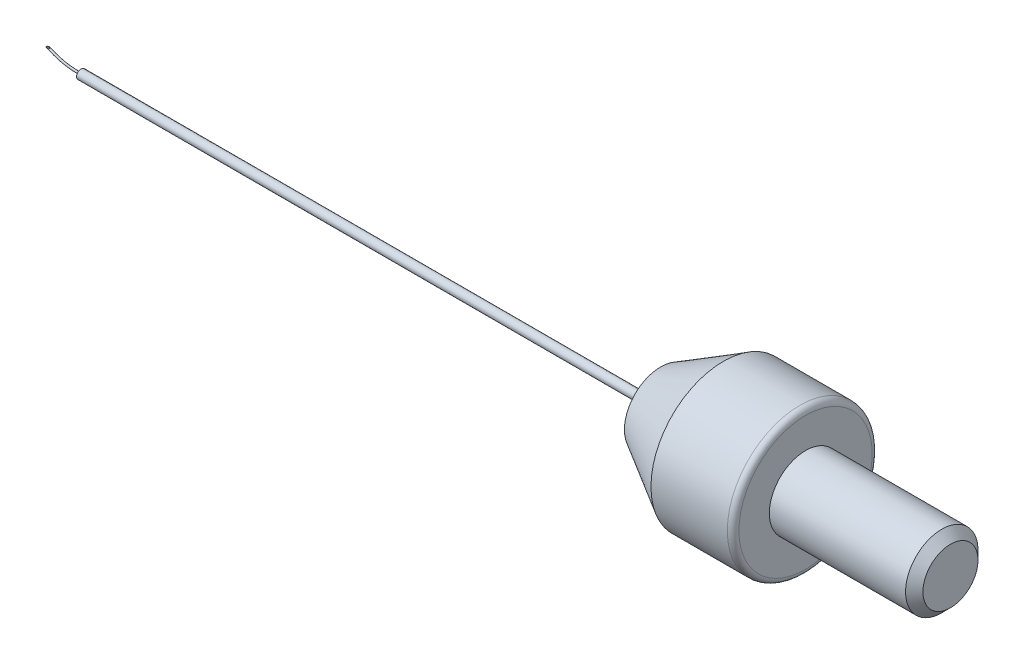
ISO-10303-21;
HEADER;
FILE_DESCRIPTION(('STEP AP214'),'2;1');
FILE_NAME('part.step','',(''),(''),'','','');
FILE_SCHEMA(('AUTOMOTIVE_DESIGN { 1 0 10303 214 1 1 1 1 }'));
ENDSEC;
DATA;
#1=APPLICATION_CONTEXT('core data for automotive mechanical design processes');
#2=APPLICATION_PROTOCOL_DEFINITION('international standard','automotive_design',2000,#1);
#3=PRODUCT_CONTEXT('',#1,'mechanical');
#4=PRODUCT('Part','Part','',(#3));
#5=PRODUCT_RELATED_PRODUCT_CATEGORY('part','',(#4));
#6=PRODUCT_DEFINITION_FORMATION('','',#4);
#7=PRODUCT_DEFINITION_CONTEXT('part definition',#1,'design');
#8=PRODUCT_DEFINITION('design','',#6,#7);
#9=PRODUCT_DEFINITION_SHAPE('','',#8);
#10=(LENGTH_UNIT() NAMED_UNIT(*) SI_UNIT(.MILLI.,.METRE.));
#11=(NAMED_UNIT(*) PLANE_ANGLE_UNIT() SI_UNIT($,.RADIAN.));
#12=(NAMED_UNIT(*) SI_UNIT($,.STERADIAN.) SOLID_ANGLE_UNIT());
#13=UNCERTAINTY_MEASURE_WITH_UNIT(LENGTH_MEASURE(1.E-05),#10,'distance_accuracy_value','');
#14=(GEOMETRIC_REPRESENTATION_CONTEXT(3) GLOBAL_UNCERTAINTY_ASSIGNED_CONTEXT((#13)) GLOBAL_UNIT_ASSIGNED_CONTEXT((#10,
#11,#12)) REPRESENTATION_CONTEXT('',''));
#15=CARTESIAN_POINT('',(0.,0.,0.));
#16=DIRECTION('',(0.,0.,1.));
#17=DIRECTION('',(1.,0.,0.));
#18=AXIS2_PLACEMENT_3D('',#15,#16,#17);
#19=CARTESIAN_POINT('',(-27.,0.,0.035));
#20=CARTESIAN_POINT('',(-27.4170242884597,-0.0146836206256108,0.035));
#21=CARTESIAN_POINT('',(-27.8116297868621,0.0708827797584399,0.035));
#22=CARTESIAN_POINT('',(-28.1838164951991,0.256699201155364,0.035));
#23=CARTESIAN_POINT('',(-27.,0.07,0.035));
#24=CARTESIAN_POINT('',(-27.4059080293465,0.0553163802134395,0.035));
#25=CARTESIAN_POINT('',(-27.7880030400854,0.137717553772996,0.035));
#26=CARTESIAN_POINT('',(-28.1503643792375,0.318188679423537,0.035));
#27=CARTESIAN_POINT('',(-27.,0.07,-0.035));
#28=CARTESIAN_POINT('',(-27.4059080293465,0.0553163802134404,-0.035));
#29=CARTESIAN_POINT('',(-27.7880030400854,0.137717553772996,-0.035));
#30=CARTESIAN_POINT('',(-28.1503643792375,0.318188679423537,-0.035));
#31=CARTESIAN_POINT('',(-27.,0.,-0.035));
#32=CARTESIAN_POINT('',(-27.4170242884597,-0.0146836206256099,-0.035));
#33=CARTESIAN_POINT('',(-27.8116297868621,0.0708827797584399,-0.035));
#34=CARTESIAN_POINT('',(-28.1838164951991,0.256699201155364,-0.035));
#35=CARTESIAN_POINT('',(-27.,-0.07,-0.035));
#36=CARTESIAN_POINT('',(-27.4281405475729,-0.0846836214646603,-0.035));
#37=CARTESIAN_POINT('',(-27.8352565336389,0.00404800574388422,-0.035));
#38=CARTESIAN_POINT('',(-28.2172686111607,0.195209722887191,-0.035));
#39=CARTESIAN_POINT('',(-27.,-0.07,0.035));
#40=CARTESIAN_POINT('',(-27.4281405475729,-0.0846836214646611,0.035));
#41=CARTESIAN_POINT('',(-27.8352565336389,0.00404800574388422,0.035));
#42=CARTESIAN_POINT('',(-28.2172686111607,0.195209722887191,0.035));
#43=CARTESIAN_POINT('',(-27.,0.,0.035));
#44=CARTESIAN_POINT('',(-27.4170242884597,-0.0146836206256108,0.035));
#45=CARTESIAN_POINT('',(-27.8116297868621,0.0708827797584399,0.035));
#46=CARTESIAN_POINT('',(-28.1838164951991,0.256699201155364,0.035));
#47=(BOUNDED_SURFACE() B_SPLINE_SURFACE(3,3,((#19,#20,#21,#22),(#23,#24,#25,#26),(#27,#28,#29,
#30),(#31,#32,#33,#34),(#35,#36,#37,#38),(#39,#40,#41,#42),(#43,#44,#45,#46)),.UNSPECIFIED.,.T.,
.F.,.F.) B_SPLINE_SURFACE_WITH_KNOTS((4,3,4),(4,4),(0.,0.5,1.),(0.,1.),
.UNSPECIFIED.) GEOMETRIC_REPRESENTATION_ITEM() RATIONAL_B_SPLINE_SURFACE(((1.,1.,1.,1.),
(0.333333333333333,0.333333333333333,0.333333333333333,0.333333333333333),(0.333333333333333,
0.333333333333333,0.333333333333333,0.333333333333333),(1.,1.,1.,1.),(0.333333333333333,
0.333333333333333,0.333333333333333,0.333333333333333),(0.333333333333333,0.333333333333333,
0.333333333333333,0.333333333333333),(1.,1.,1.,1.))) REPRESENTATION_ITEM('') SURFACE());
#48=CARTESIAN_POINT('',(-27.,0.,0.));
#49=DIRECTION('',(-1.,0.,0.));
#50=DIRECTION('',(0.,0.,1.));
#51=AXIS2_PLACEMENT_3D('',#48,#49,#50);
#52=CIRCLE('',#51,0.035);
#53=CARTESIAN_POINT('',(-27.,0.,0.035));
#54=VERTEX_POINT('',#53);
#55=EDGE_CURVE('E64',#54,#54,#52,.T.);
#56=CARTESIAN_POINT('',(-28.1345079441962,0.232730172733482,0.035));
#57=CARTESIAN_POINT('',(-28.1403781410976,0.23212784171849,0.035000459442131));
#58=CARTESIAN_POINT('',(-28.1462495657998,0.231525380258844,0.0346042798892061));
#59=CARTESIAN_POINT('',(-28.1578682816208,0.230333199516062,0.0329435476940316));
#60=CARTESIAN_POINT('',(-28.1636158331756,0.229743453498144,0.0316810482643481));
#61=CARTESIAN_POINT('',(-28.1737201674923,0.228706664503048,0.0284117801471621));
#62=CARTESIAN_POINT('',(-28.1781354643464,0.228253617736801,0.0265892530971109));
#63=CARTESIAN_POINT('',(-28.1865254616945,0.22739273333318,0.0219359519237533));
#64=CARTESIAN_POINT('',(-28.1904972343875,0.2269851961143,0.0190989442661192));
#65=CARTESIAN_POINT('',(-28.1955694949955,0.226464739609817,0.0136033069795441));
#66=CARTESIAN_POINT('',(-28.1971607842477,0.226301459981525,0.0114285434972753));
#67=CARTESIAN_POINT('',(-28.1995406461706,0.226057266140342,0.00660336952401806));
#68=CARTESIAN_POINT('',(-28.2003216709279,0.225977126406317,0.00394875237267297));
#69=CARTESIAN_POINT('',(-28.2006548799446,0.22594293634295,-0.00106177049862607));
#70=CARTESIAN_POINT('',(-28.2003660303625,0.225972574744379,-0.00340646622919166));
#71=CARTESIAN_POINT('',(-28.1990778570449,0.226104752157446,-0.00768835343020406));
#72=CARTESIAN_POINT('',(-28.1981295770486,0.22620205365306,-0.00964257008199435));
#73=CARTESIAN_POINT('',(-28.1950478028521,0.226518269584318,-0.0144362443135136));
#74=CARTESIAN_POINT('',(-28.1925446498112,0.226775114125637,-0.0170226809346205));
#75=CARTESIAN_POINT('',(-28.1851587654535,0.227532967937244,-0.0230465137879778));
#76=CARTESIAN_POINT('',(-28.1798185365821,0.228080920300025,-0.0258584137310062));
#77=CARTESIAN_POINT('',(-28.1692759894893,0.229162674235667,-0.0300288540523444));
#78=CARTESIAN_POINT('',(-28.1641119720879,0.229692545822327,-0.0315033401535746));
#79=CARTESIAN_POINT('',(-28.1536222276332,0.230768881764481,-0.033672377200365));
#80=CARTESIAN_POINT('',(-28.1482964559816,0.231315350696142,-0.0343667110027478));
#81=CARTESIAN_POINT('',(-28.1372382599205,0.232450014551239,-0.0351006803877984));
#82=CARTESIAN_POINT('',(-28.1315030290277,0.233038497443525,-0.0350920736940076));
#83=CARTESIAN_POINT('',(-28.1200120245339,0.234217571078399,-0.0343151592491671));
#84=CARTESIAN_POINT('',(-28.1142567673076,0.234808108836553,-0.033538156204836));
#85=CARTESIAN_POINT('',(-28.1029284227986,0.235970492201412,-0.0311310101604022));
#86=CARTESIAN_POINT('',(-28.0973554312331,0.236542327986732,-0.0295004263079689));
#87=CARTESIAN_POINT('',(-28.0862801539766,0.237678744480527,-0.0250013094387353));
#88=CARTESIAN_POINT('',(-28.0807978240134,0.238241277560365,-0.0220708610118972));
#89=CARTESIAN_POINT('',(-28.0738781793501,0.238951291261933,-0.0163224385899703));
#90=CARTESIAN_POINT('',(-28.0718388080235,0.239160547912472,-0.0142710858178655));
#91=CARTESIAN_POINT('',(-28.0684454261573,0.239508737442051,-0.00955690671724776));
#92=CARTESIAN_POINT('',(-28.067098896239,0.239646902746534,-0.00688783966494199));
#93=CARTESIAN_POINT('',(-28.065989555461,0.239760730441867,-0.002104956635132));
#94=CARTESIAN_POINT('',(-28.0658599651098,0.239774027498162,-8.34189472398771E-05));
#95=CARTESIAN_POINT('',(-28.0662874231324,0.239730166710831,0.0038759133525735));
#96=CARTESIAN_POINT('',(-28.0668437474732,0.239673083159079,0.00581379403718324));
#97=CARTESIAN_POINT('',(-28.0687913911255,0.23947323855139,0.01018969643692));
#98=CARTESIAN_POINT('',(-28.0704312933857,0.239304970794479,0.0125077263755494));
#99=CARTESIAN_POINT('',(-28.0753864642481,0.23879652862486,0.0179573232703016));
#100=CARTESIAN_POINT('',(-28.079106378606,0.238414834164995,0.0206816198412609));
#101=CARTESIAN_POINT('',(-28.0867442059386,0.237631128847394,0.0251126551619395));
#102=CARTESIAN_POINT('',(-28.0906361119515,0.237231786527075,0.026871419423226));
#103=CARTESIAN_POINT('',(-28.0986322430501,0.2364113164199,0.0298195834445177));
#104=CARTESIAN_POINT('',(-28.1027367340424,0.235990161349111,0.0310082500765262));
#105=CARTESIAN_POINT('',(-28.1113888352926,0.235102382473736,0.0329884001394123));
#106=CARTESIAN_POINT('',(-28.1159452303133,0.234634857197722,0.0337394448423047));
#107=CARTESIAN_POINT('',(-28.1251696842905,0.233688353027537,0.0347482918714841));
#108=CARTESIAN_POINT('',(-28.1298384257919,0.233209304150573,0.0349996345312564));
#109=CARTESIAN_POINT('',(-28.1345079441962,0.232730172733482,0.035));
#110=B_SPLINE_CURVE_WITH_KNOTS('',3,(#56,#57,#58,#59,#60,#61,#62,#63,#64,#65,#66,#67,#68,#69,
#70,#71,#72,#73,#74,#75,#76,#77,#78,#79,#80,#81,#82,#83,#84,#85,#86,#87,#88,#89,#90,#91,#92,#93,
#94,#95,#96,#97,#98,#99,#100,#101,#102,#103,#104,#105,#106,#107,#108,#109),.UNSPECIFIED.,.T.,
.F.,(4,2,2,2,2,2,2,2,2,2,2,2,2,2,2,2,2,2,2,2,2,2,2,2,2,2,4),(0.,0.017692638182096,
0.0353434882836878,0.0496803637450713,0.0641068909796249,0.0721047307134609,0.0801764219650635,
0.0871001742671502,0.0935402303971793,0.104177083037625,0.122079530501015,0.138217162125708,
0.154359284295696,0.171610100576242,0.189058389745547,0.206515699407223,0.22491276067358,
0.233540534844674,0.242259605365167,0.248214109442833,0.254162333484195,0.262545456663282,
0.276209042752414,0.289037322663364,0.301882055406552,0.315777389339945,0.329851210201355),.UNSPECIFIED.);
#111=CARTESIAN_POINT('',(-28.1345079278636,0.232730169567079,0.035));
#112=VERTEX_POINT('',#111);
#113=EDGE_CURVE('E69',#112,#112,#110,.T.);
#114=CARTESIAN_POINT('',(-27.,0.,0.035));
#115=CARTESIAN_POINT('',(-27.0062232811663,-0.000219125890822873,0.035));
#116=CARTESIAN_POINT('',(-27.0124473432152,-0.000416127155249666,0.035));
#117=CARTESIAN_POINT('',(-27.0248854656528,-0.000765315896354813,0.035));
#118=CARTESIAN_POINT('',(-27.0310995237863,-0.000917583726397852,0.035));
#119=CARTESIAN_POINT('',(-27.0435176388903,-0.00117730612424889,0.035));
#120=CARTESIAN_POINT('',(-27.0497216942204,-0.00128483906911426,0.035));
#121=CARTESIAN_POINT('',(-27.0621198028012,-0.0014550940714331,0.035));
#122=CARTESIAN_POINT('',(-27.0683138550027,-0.00151789248703942,0.035));
#123=CARTESIAN_POINT('',(-27.0806919568208,-0.00159868036129314,0.035));
#124=CARTESIAN_POINT('',(-27.0868760059517,-0.00161674412149236,0.035));
#125=CARTESIAN_POINT('',(-27.0992341010475,-0.00160806478287869,0.035));
#126=CARTESIAN_POINT('',(-27.1054081470624,-0.00158139389114977,0.035));
#127=CARTESIAN_POINT('',(-27.1177462354008,-0.00148324734946994,0.035));
#128=CARTESIAN_POINT('',(-27.123910278281,-0.0014118417754859,0.035));
#129=CARTESIAN_POINT('',(-27.1362283598465,-0.00122422801572992,0.035));
#130=CARTESIAN_POINT('',(-27.1423823995654,-0.00110808773908509,0.035));
#131=CARTESIAN_POINT('',(-27.1546804743364,-0.000831006753372344,0.035));
#132=CARTESIAN_POINT('',(-27.1608245108684,-0.00067013175193941,0.035));
#133=CARTESIAN_POINT('',(-27.1731025788247,-0.000303583531002012,0.035));
#134=CARTESIAN_POINT('',(-27.1792366121432,-9.79737840886796E-05,0.035));
#135=CARTESIAN_POINT('',(-27.1914946732632,0.000358041680431032,0.035));
#136=CARTESIAN_POINT('',(-27.1976187033411,0.00060838619288279,0.035));
#137=CARTESIAN_POINT('',(-27.2098567576032,0.00115386890902595,0.035));
#138=CARTESIAN_POINT('',(-27.2159707844126,0.0014489482061831,0.035));
#139=CARTESIAN_POINT('',(-27.2281888317946,0.00208389818149505,0.035));
#140=CARTESIAN_POINT('',(-27.2342928553071,0.00242371228166025,0.035));
#141=CARTESIAN_POINT('',(-27.2464908957865,0.00314812952322089,0.035));
#142=CARTESIAN_POINT('',(-27.2525849159731,0.00353267844378735,0.035));
#143=CARTESIAN_POINT('',(-27.2647629495268,0.0043465629581828,0.035));
#144=CARTESIAN_POINT('',(-27.270846966358,0.00477584671560424,0.035));
#145=CARTESIAN_POINT('',(-27.2830049929627,0.00567919850891695,0.035));
#146=CARTESIAN_POINT('',(-27.2890790064083,0.00615321711868129,0.035));
#147=CARTESIAN_POINT('',(-27.3012170260402,0.00714603619647732,0.035));
#148=CARTESIAN_POINT('',(-27.3072810360698,0.00766478967307697,0.035));
#149=CARTESIAN_POINT('',(-27.3193990487048,0.00874707604039092,0.035));
#150=CARTESIAN_POINT('',(-27.3254530552873,0.00931056439729528,0.035));
#151=CARTESIAN_POINT('',(-27.3375510609009,0.0104823180586209,0.035));
#152=CARTESIAN_POINT('',(-27.343595064005,0.0110905413082542,0.035));
#153=CARTESIAN_POINT('',(-27.3556730625725,0.0123517622675321,0.035));
#154=CARTESIAN_POINT('',(-27.3617070621662,0.013004720421246,0.035));
#155=CARTESIAN_POINT('',(-27.3737650536626,0.0143554086818531,0.035));
#156=CARTESIAN_POINT('',(-27.3797890497139,0.0150531017499076,0.035));
#157=CARTESIAN_POINT('',(-27.3918270341138,0.0164932573146497,0.035));
#158=CARTESIAN_POINT('',(-27.3978410265902,0.0172356853061919,0.035));
#159=CARTESIAN_POINT('',(-27.4098590038681,0.0187653081772922,0.035));
#160=CARTESIAN_POINT('',(-27.4158629927368,0.0195524711003352,0.035));
#161=CARTESIAN_POINT('',(-27.427860962867,0.0211715612794291,0.035));
#162=CARTESIAN_POINT('',(-27.433854948095,0.0220034591408399,0.035));
#163=CARTESIAN_POINT('',(-27.4458329110516,0.0237120166289679,0.035));
#164=CARTESIAN_POINT('',(-27.4518168926058,0.0245886494344474,0.035));
#165=CARTESIAN_POINT('',(-27.4637748483625,0.0263866742320478,0.035));
#166=CARTESIAN_POINT('',(-27.4697488262095,0.0273080419861205,0.035));
#167=CARTESIAN_POINT('',(-27.4816867747403,0.0291955340930274,0.035));
#168=CARTESIAN_POINT('',(-27.4876507488465,0.03016163679903,0.035));
#169=CARTESIAN_POINT('',(-27.499568690125,0.032138596214467,0.035));
#170=CARTESIAN_POINT('',(-27.505522660457,0.0331494338745372,0.035));
#171=CARTESIAN_POINT('',(-27.5174205944567,0.0352158605971158,0.035));
#172=CARTESIAN_POINT('',(-27.5233645609809,0.0362714332121878,0.035));
#173=CARTESIAN_POINT('',(-27.5352424876754,0.0384273272399069,0.035));
#174=CARTESIAN_POINT('',(-27.5411764503582,0.0395276348097044,0.035));
#175=CARTESIAN_POINT('',(-27.5530343697209,0.0417729961399471,0.035));
#176=CARTESIAN_POINT('',(-27.5589583285287,0.0429180386629802,0.035));
#177=CARTESIAN_POINT('',(-27.5707962405333,0.0452528672925167,0.035));
#178=CARTESIAN_POINT('',(-27.5767101954327,0.0464426447660825,0.035));
#179=CARTESIAN_POINT('',(-27.5885281000525,0.0488669406910703,0.035));
#180=CARTESIAN_POINT('',(-27.5944320510102,0.0501014531112516,0.035));
#181=CARTESIAN_POINT('',(-27.6062299482189,0.0526152163272392,0.035));
#182=CARTESIAN_POINT('',(-27.6121238952017,0.0538944636889108,0.035));
#183=CARTESIAN_POINT('',(-27.6239017849729,0.0564976941908395,0.035));
#184=CARTESIAN_POINT('',(-27.6297857279479,0.0578216764876689,0.035));
#185=CARTESIAN_POINT('',(-27.6415436102555,0.0605143742698792,0.035));
#186=CARTESIAN_POINT('',(-27.6474175491899,0.0618830914943408,0.035));
#187=CARTESIAN_POINT('',(-27.6591554240077,0.0646652565505778,0.035));
#188=CARTESIAN_POINT('',(-27.6650193588692,0.0660787086939546,0.035));
#189=CARTESIAN_POINT('',(-27.6767372261714,0.0689503410173736,0.035));
#190=CARTESIAN_POINT('',(-27.682591156928,0.0704085280697754,0.035));
#191=CARTESIAN_POINT('',(-27.6942890166887,0.0733696276529525,0.035));
#192=CARTESIAN_POINT('',(-27.7001329433086,0.0748725496033256,0.035));
#193=CARTESIAN_POINT('',(-27.7118107955025,0.0779231164382621,0.035));
#194=CARTESIAN_POINT('',(-27.7176447179544,0.079470773274405,0.035));
#195=CARTESIAN_POINT('',(-27.7293025625562,0.0826108073525418,0.035));
#196=CARTESIAN_POINT('',(-27.7351264808093,0.0842031990611261,0.035));
#197=CARTESIAN_POINT('',(-27.7467643177939,0.0874327003733513,0.035));
#198=CARTESIAN_POINT('',(-27.752578231818,0.0890698269399354,0.035));
#199=CARTESIAN_POINT('',(-27.7641960611607,0.0923887954765973,0.035));
#200=CARTESIAN_POINT('',(-27.7699999709259,0.0940706568856544,0.035));
#201=CARTESIAN_POINT('',(-27.7815977926024,0.0974790926365731,0.035));
#202=CARTESIAN_POINT('',(-27.7873916980795,0.0992056888715066,0.035));
#203=CARTESIAN_POINT('',(-27.7989695120656,0.102703591825988,0.035));
#204=CARTESIAN_POINT('',(-27.8047534132259,0.104474922869164,0.035));
#205=CARTESIAN_POINT('',(-27.8163112194982,0.108062293016015,0.035));
#206=CARTESIAN_POINT('',(-27.8220851163136,0.109878358848783,0.035));
#207=CARTESIAN_POINT('',(-27.8336229148486,0.113555196176323,0.035));
#208=CARTESIAN_POINT('',(-27.8393868072919,0.115415996779045,0.035));
#209=CARTESIAN_POINT('',(-27.8509045980668,0.119182301275126,0.035));
#210=CARTESIAN_POINT('',(-27.8566584861112,0.121087836627208,0.035));
#211=CARTESIAN_POINT('',(-27.8681562691035,0.124943608279228,0.035));
#212=CARTESIAN_POINT('',(-27.8739001527231,0.126893878359149,0.035));
#213=CARTESIAN_POINT('',(-27.8853779279108,0.130839117154071,0.035));
#214=CARTESIAN_POINT('',(-27.8911118070803,0.132834121939413,0.035));
#215=CARTESIAN_POINT('',(-27.902569574442,0.136868827863779,0.035));
#216=CARTESIAN_POINT('',(-27.908293449137,0.138908567331267,0.035));
#217=CARTESIAN_POINT('',(-27.9197312086515,0.143032740371221,0.035));
#218=CARTESIAN_POINT('',(-27.9254450788483,0.14511721449675,0.035));
#219=CARTESIAN_POINT('',(-27.9368628304952,0.149330854638053,0.035));
#220=CARTESIAN_POINT('',(-27.9425666961709,0.151460063396728,0.035));
#221=CARTESIAN_POINT('',(-27.9539644399301,0.155763170624779,0.035));
#222=CARTESIAN_POINT('',(-27.9596583010628,0.157937113990948,0.035));
#223=CARTESIAN_POINT('',(-27.9710360369148,0.162329688290807,0.035));
#224=CARTESIAN_POINT('',(-27.9767198934833,0.164548366238108,0.035));
#225=CARTESIAN_POINT('',(-27.9880776214092,0.169030407594488,0.035));
#226=CARTESIAN_POINT('',(-27.9937514733932,0.171293820095846,0.035));
#227=CARTESIAN_POINT('',(-28.0050891933746,0.175865328493254,0.035));
#228=CARTESIAN_POINT('',(-28.0107530407545,0.178173475521082,0.035));
#229=CARTESIAN_POINT('',(-28.0220707527739,0.182834450943379,0.035));
#230=CARTESIAN_POINT('',(-28.0277245955318,0.185187332468996,0.035));
#231=CARTESIAN_POINT('',(-28.0390222995705,0.189937774901141,0.035));
#232=CARTESIAN_POINT('',(-28.0446661376867,0.192335390897159,0.035));
#233=CARTESIAN_POINT('',(-28.0559438337338,0.197175300318781,0.035));
#234=CARTESIAN_POINT('',(-28.0615776671996,0.19961765075033,0.035));
#235=CARTESIAN_POINT('',(-28.0728353552173,0.204547027159871,0.035));
#236=CARTESIAN_POINT('',(-28.0784591839868,0.207034112017638,0.035));
#237=CARTESIAN_POINT('',(-28.0896968640419,0.21205295534216,0.035));
#238=CARTESIAN_POINT('',(-28.0953106882131,0.214584774518992,0.035));
#239=CARTESIAN_POINT('',(-28.1065283599826,0.219693084951603,0.035));
#240=CARTESIAN_POINT('',(-28.1121321791199,0.222269638704256,0.035));
#241=CARTESIAN_POINT('',(-28.1233298437425,0.227467415442098,0.035));
#242=CARTESIAN_POINT('',(-28.1289236594105,0.230088702664173,0.035));
#243=CARTESIAN_POINT('',(-28.1345079278636,0.232730169567079,0.035));
#244=B_SPLINE_CURVE_WITH_KNOTS('',3,(#114,#115,#116,#117,#118,#119,#120,#121,#122,#123,#124,
#125,#126,#127,#128,#129,#130,#131,#132,#133,#134,#135,#136,#137,#138,#139,#140,#141,#142,#143,
#144,#145,#146,#147,#148,#149,#150,#151,#152,#153,#154,#155,#156,#157,#158,#159,#160,#161,#162,
#163,#164,#165,#166,#167,#168,#169,#170,#171,#172,#173,#174,#175,#176,#177,#178,#179,#180,#181,
#182,#183,#184,#185,#186,#187,#188,#189,#190,#191,#192,#193,#194,#195,#196,#197,#198,#199,#200,
#201,#202,#203,#204,#205,#206,#207,#208,#209,#210,#211,#212,#213,#214,#215,#216,#217,#218,#219,
#220,#221,#222,#223,#224,#225,#226,#227,#228,#229,#230,#231,#232,#233,#234,#235,#236,#237,#238,
#239,#240,#241,#242,#243),.UNSPECIFIED.,.F.,.F.,(4,2,2,2,2,2,2,2,2,2,2,2,2,2,2,2,2,2,2,2,2,2,2,
2,2,2,2,2,2,2,2,2,2,2,2,2,2,2,2,2,2,2,2,2,2,2,2,2,2,2,2,2,2,2,2,2,2,2,2,2,2,2,2,2,4),(0.,
0.0186813766154984,0.0373289883127821,0.0559437897397153,0.0745267406008057,0.0930788055434691,
0.111600954040811,0.130094160270895,0.148559402992517,0.166997665417658,0.185409935080521,
0.203797203703315,0.222160467058877,0.240500724830097,0.258818980466268,0.277116241036658,
0.295393517080925,0.313651822456978,0.331892174186111,0.350115592295476,0.368323099658245,
0.386515721831288,0.40469448689073,0.422860425265397,0.441014569568199,0.459157954425818,
0.477291616306585,0.495416593346838,0.513533925175878,0.531644652739585,0.549749818122972,
0.567850464371729,0.585947635312929,0.604042375375085,0.62213572940767,0.640228742500302,
0.658322459801647,0.676417926338378,0.694516186834134,0.712618285528821,0.730725265998304,
0.74883817097463,0.766958042167072,0.785085920083951,0.803222843855583,0.821369851058313,
0.839527977539968,0.857698257246713,0.875881722051545,0.894079401584526,0.912292323064946,
0.930521511135402,0.948767987698122,0.967032771753492,0.985316879240997,1.00362132288263,
1.02194711202891,1.04029525250768,1.05866674647557,1.07706259227254,1.09548378427928,
1.11393131277776,1.13240616381491,1.15090931906954,1.16944175572259),.UNSPECIFIED.);
#245=EDGE_CURVE('BSEAM49',#54,#112,#244,.T.);
#246=ORIENTED_EDGE('',*,*,#55,.T.);
#247=ORIENTED_EDGE('',*,*,#113,.T.);
#248=ORIENTED_EDGE('',*,*,#245,.T.);
#249=ORIENTED_EDGE('',*,*,#245,.F.);
#250=EDGE_LOOP('',(#246,#248,#247,#249));
#251=FACE_BOUND('',#250,.T.);
#252=ADVANCED_FACE('F49',(#251),#47,.T.);
#253=CARTESIAN_POINT('',(-27.,0.,0.025));
#254=CARTESIAN_POINT('',(-27.4170242884597,-0.0146836206256108,0.025));
#255=CARTESIAN_POINT('',(-27.8116297868621,0.0708827797584399,0.025));
#256=CARTESIAN_POINT('',(-28.1838164951991,0.256699201155364,0.025));
#257=CARTESIAN_POINT('',(-27.,-0.05,0.025));
#258=CARTESIAN_POINT('',(-27.4249644735414,-0.0646836212249335,0.025));
#259=CARTESIAN_POINT('',(-27.8285060345594,0.0231436554618647,0.025));
#260=CARTESIAN_POINT('',(-28.2077108637431,0.212778145249526,0.025));
#261=CARTESIAN_POINT('',(-27.,-0.05,-0.025));
#262=CARTESIAN_POINT('',(-27.4249644735414,-0.0646836212249333,-0.025));
#263=CARTESIAN_POINT('',(-27.8285060345594,0.0231436554618647,-0.025));
#264=CARTESIAN_POINT('',(-28.2077108637431,0.212778145249526,-0.025));
#265=CARTESIAN_POINT('',(-27.,0.,-0.025));
#266=CARTESIAN_POINT('',(-27.4170242884597,-0.0146836206256106,-0.025));
#267=CARTESIAN_POINT('',(-27.8116297868621,0.0708827797584399,-0.025));
#268=CARTESIAN_POINT('',(-28.1838164951991,0.256699201155364,-0.025));
#269=CARTESIAN_POINT('',(-27.,0.05,-0.025));
#270=CARTESIAN_POINT('',(-27.409084103378,0.0353163799737122,-0.025));
#271=CARTESIAN_POINT('',(-27.7947535391649,0.118621904055015,-0.025));
#272=CARTESIAN_POINT('',(-28.1599221266551,0.300620257061202,-0.025));
#273=CARTESIAN_POINT('',(-27.,0.05,0.025));
#274=CARTESIAN_POINT('',(-27.409084103378,0.035316379973712,0.025));
#275=CARTESIAN_POINT('',(-27.7947535391649,0.118621904055015,0.025));
#276=CARTESIAN_POINT('',(-28.1599221266551,0.300620257061202,0.025));
#277=CARTESIAN_POINT('',(-27.,0.,0.025));
#278=CARTESIAN_POINT('',(-27.4170242884597,-0.0146836206256108,0.025));
#279=CARTESIAN_POINT('',(-27.8116297868621,0.0708827797584399,0.025));
#280=CARTESIAN_POINT('',(-28.1838164951991,0.256699201155364,0.025));
#281=(BOUNDED_SURFACE() B_SPLINE_SURFACE(3,3,((#253,#254,#255,#256),(#257,#258,#259,#260),(#261,
#262,#263,#264),(#265,#266,#267,#268),(#269,#270,#271,#272),(#273,#274,#275,#276),(#277,#278,
#279,#280)),.UNSPECIFIED.,.T.,.F.,.F.) B_SPLINE_SURFACE_WITH_KNOTS((4,3,4),(4,4),(0.,0.5,1.),
(0.,1.),.UNSPECIFIED.) GEOMETRIC_REPRESENTATION_ITEM() RATIONAL_B_SPLINE_SURFACE(((1.,1.,1.,1.),
(0.333333333333333,0.333333333333333,0.333333333333333,0.333333333333333),(0.333333333333333,
0.333333333333333,0.333333333333333,0.333333333333333),(1.,1.,1.,1.),(0.333333333333333,
0.333333333333333,0.333333333333333,0.333333333333333),(0.333333333333333,0.333333333333333,
0.333333333333333,0.333333333333333),(1.,1.,1.,1.))) REPRESENTATION_ITEM('') SURFACE());
#282=CARTESIAN_POINT('',(-27.,0.,0.));
#283=DIRECTION('',(-1.,0.,0.));
#284=DIRECTION('',(0.,0.,1.));
#285=AXIS2_PLACEMENT_3D('',#282,#283,#284);
#286=CIRCLE('',#285,0.025);
#287=CARTESIAN_POINT('',(-27.,0.,0.025));
#288=VERTEX_POINT('',#287);
#289=EDGE_CURVE('E11',#288,#288,#286,.F.);
#290=CARTESIAN_POINT('',(-28.1345079441962,0.232730172733482,0.025));
#291=CARTESIAN_POINT('',(-28.132442339736,0.23294212013362,0.0250000157207005));
#292=CARTESIAN_POINT('',(-28.1303763359222,0.233154106981637,0.0249305805164682));
#293=CARTESIAN_POINT('',(-28.1241267248627,0.233795365503924,0.0245100708090595));
#294=CARTESIAN_POINT('',(-28.1199560402993,0.234223314812687,0.0239424272647017));
#295=CARTESIAN_POINT('',(-28.1117494840332,0.235065377895518,0.0221713014875265));
#296=CARTESIAN_POINT('',(-28.1077132826522,0.235479525504269,0.0209695179277487));
#297=CARTESIAN_POINT('',(-28.1012667090782,0.236140997895122,0.0182702689140256));
#298=CARTESIAN_POINT('',(-28.0987617482485,0.236398028026678,0.0170037466341619));
#299=CARTESIAN_POINT('',(-28.0940320695517,0.23688333280716,0.013949596599428));
#300=CARTESIAN_POINT('',(-28.0918088228423,0.23711145650195,0.0121593827945625));
#301=CARTESIAN_POINT('',(-28.0888098093616,0.237419180503354,0.00867672611114219));
#302=CARTESIAN_POINT('',(-28.087803463594,0.237522440085572,0.00719696111193261));
#303=CARTESIAN_POINT('',(-28.0863413320604,0.237672467095914,0.00393791192993545));
#304=CARTESIAN_POINT('',(-28.0858908206899,0.237718693326057,0.00215593814788893));
#305=CARTESIAN_POINT('',(-28.0857936144902,0.237728667506505,-0.00116852782196936));
#306=CARTESIAN_POINT('',(-28.0860389898487,0.237703489955387,-0.00270792623314317));
#307=CARTESIAN_POINT('',(-28.0870940820289,0.237595228650854,-0.0058846873309188));
#308=CARTESIAN_POINT('',(-28.0880005936429,0.237502212932751,-0.00748669617073027));
#309=CARTESIAN_POINT('',(-28.0907595185017,0.237219124045937,-0.0111529410625054));
#310=CARTESIAN_POINT('',(-28.0928586236105,0.237003738224293,-0.013012412884017));
#311=CARTESIAN_POINT('',(-28.0992150156051,0.236351518987226,-0.0175136584153992));
#312=CARTESIAN_POINT('',(-28.1038430854992,0.235876640111888,-0.0195688793546784));
#313=CARTESIAN_POINT('',(-28.1128341401663,0.234954082345903,-0.0224815490130713));
#314=CARTESIAN_POINT('',(-28.117168347716,0.234509356237689,-0.0234477596679243));
#315=CARTESIAN_POINT('',(-28.1237285254419,0.233836226862373,-0.0243929812017084));
#316=CARTESIAN_POINT('',(-28.1259214214548,0.233611217295162,-0.0246240709589139));
#317=CARTESIAN_POINT('',(-28.1370277254275,0.232471617146891,-0.0254043381701649));
#318=CARTESIAN_POINT('',(-28.1460929651999,0.231541447385216,-0.0247827830685149));
#319=CARTESIAN_POINT('',(-28.1592379252196,0.230192663987067,-0.0215326215636573));
#320=CARTESIAN_POINT('',(-28.1636001824347,0.229745059714877,-0.0200257402940835));
#321=CARTESIAN_POINT('',(-28.1707887766806,0.229007449576703,-0.0163201164660431));
#322=CARTESIAN_POINT('',(-28.1737301257523,0.228705642488698,-0.0143800007363133));
#323=CARTESIAN_POINT('',(-28.1776819073876,0.228300156484232,-0.010501194928813));
#324=CARTESIAN_POINT('',(-28.1789890693462,0.22816603066722,-0.00888971607790963));
#325=CARTESIAN_POINT('',(-28.1807942104896,0.22798080799192,-0.00562900882296502));
#326=CARTESIAN_POINT('',(-28.1813979869309,0.227918855445436,-0.00404357323688401));
#327=CARTESIAN_POINT('',(-28.1819889795297,0.227858214620918,-0.000740420968360246));
#328=CARTESIAN_POINT('',(-28.1819729086074,0.227859863624908,0.000977952704636569));
#329=CARTESIAN_POINT('',(-28.1813582827729,0.227922929400083,0.00410791112930514));
#330=CARTESIAN_POINT('',(-28.1808201054263,0.227978150924188,0.00553284767299891));
#331=CARTESIAN_POINT('',(-28.1790406297002,0.228160740074329,0.00886161601439045));
#332=CARTESIAN_POINT('',(-28.1775809918909,0.228310511146637,0.0106407651035798));
#333=CARTESIAN_POINT('',(-28.1732587665568,0.228754007907419,0.0147647349702427));
#334=CARTESIAN_POINT('',(-28.1700928814033,0.229078854612059,0.0167550866143539));
#335=CARTESIAN_POINT('',(-28.160740012032,0.230038536626197,0.021326872968446));
#336=CARTESIAN_POINT('',(-28.1541895217734,0.230710669265146,0.0230731786227616));
#337=CARTESIAN_POINT('',(-28.1432356282703,0.231834636300433,0.0246898354014317));
#338=CARTESIAN_POINT('',(-28.1388726777897,0.23228231644963,0.0249999667813123));
#339=CARTESIAN_POINT('',(-28.1345079441962,0.232730172733482,0.025));
#340=B_SPLINE_CURVE_WITH_KNOTS('',3,(#290,#291,#292,#293,#294,#295,#296,#297,#298,#299,#300,
#301,#302,#303,#304,#305,#306,#307,#308,#309,#310,#311,#312,#313,#314,#315,#316,#317,#318,#319,
#320,#321,#322,#323,#324,#325,#326,#327,#328,#329,#330,#331,#332,#333,#334,#335,#336,#337,#338,
#339),.UNSPECIFIED.,.T.,.F.,(4,2,2,2,2,2,2,2,2,2,2,2,2,2,2,2,2,2,2,2,2,2,2,2,4),(0.,
0.00622947374060177,0.0188817975685178,0.0315004003510794,0.0399260353012865,0.0483940003736645,
0.053702896079251,0.0590617905904393,0.0636368857057645,0.0690660084518767,0.0773714254282357,
0.0924050413905147,0.105746885852964,0.112396054233021,0.139271413710447,0.153090604275025,
0.163536953922192,0.169689389180472,0.174687656299596,0.179712433091292,0.184217846121943,
0.191013109182694,0.202108378909211,0.222224601426377,0.23538781530868),.UNSPECIFIED.);
#341=CARTESIAN_POINT('',(-28.1345079278636,0.232730169567079,0.025));
#342=VERTEX_POINT('',#341);
#343=EDGE_CURVE('E55',#342,#342,#340,.T.);
#344=CARTESIAN_POINT('',(-27.,0.,0.025));
#345=CARTESIAN_POINT('',(-27.0062232811663,-0.000219125890822873,0.025));
#346=CARTESIAN_POINT('',(-27.0124473432152,-0.000416127155249666,0.025));
#347=CARTESIAN_POINT('',(-27.0248854656528,-0.000765315896354813,0.025));
#348=CARTESIAN_POINT('',(-27.0310995237863,-0.000917583726397852,0.025));
#349=CARTESIAN_POINT('',(-27.0435176388903,-0.00117730612424889,0.025));
#350=CARTESIAN_POINT('',(-27.0497216942204,-0.00128483906911426,0.025));
#351=CARTESIAN_POINT('',(-27.0621198028012,-0.0014550940714331,0.025));
#352=CARTESIAN_POINT('',(-27.0683138550027,-0.00151789248703942,0.025));
#353=CARTESIAN_POINT('',(-27.0806919568208,-0.00159868036129314,0.025));
#354=CARTESIAN_POINT('',(-27.0868760059517,-0.00161674412149236,0.025));
#355=CARTESIAN_POINT('',(-27.0992341010475,-0.00160806478287869,0.025));
#356=CARTESIAN_POINT('',(-27.1054081470624,-0.00158139389114977,0.025));
#357=CARTESIAN_POINT('',(-27.1177462354008,-0.00148324734946994,0.025));
#358=CARTESIAN_POINT('',(-27.123910278281,-0.0014118417754859,0.025));
#359=CARTESIAN_POINT('',(-27.1362283598465,-0.00122422801572992,0.025));
#360=CARTESIAN_POINT('',(-27.1423823995654,-0.00110808773908509,0.025));
#361=CARTESIAN_POINT('',(-27.1546804743364,-0.000831006753372344,0.025));
#362=CARTESIAN_POINT('',(-27.1608245108684,-0.00067013175193941,0.025));
#363=CARTESIAN_POINT('',(-27.1731025788247,-0.000303583531002012,0.025));
#364=CARTESIAN_POINT('',(-27.1792366121432,-9.79737840886796E-05,0.025));
#365=CARTESIAN_POINT('',(-27.1914946732632,0.000358041680431032,0.025));
#366=CARTESIAN_POINT('',(-27.1976187033411,0.00060838619288279,0.025));
#367=CARTESIAN_POINT('',(-27.2098567576032,0.00115386890902595,0.025));
#368=CARTESIAN_POINT('',(-27.2159707844126,0.0014489482061831,0.025));
#369=CARTESIAN_POINT('',(-27.2281888317946,0.00208389818149505,0.025));
#370=CARTESIAN_POINT('',(-27.2342928553071,0.00242371228166025,0.025));
#371=CARTESIAN_POINT('',(-27.2464908957865,0.00314812952322089,0.025));
#372=CARTESIAN_POINT('',(-27.2525849159731,0.00353267844378735,0.025));
#373=CARTESIAN_POINT('',(-27.2647629495268,0.0043465629581828,0.025));
#374=CARTESIAN_POINT('',(-27.270846966358,0.00477584671560424,0.025));
#375=CARTESIAN_POINT('',(-27.2830049929627,0.00567919850891695,0.025));
#376=CARTESIAN_POINT('',(-27.2890790064083,0.00615321711868129,0.025));
#377=CARTESIAN_POINT('',(-27.3012170260402,0.00714603619647732,0.025));
#378=CARTESIAN_POINT('',(-27.3072810360698,0.00766478967307697,0.025));
#379=CARTESIAN_POINT('',(-27.3193990487048,0.00874707604039092,0.025));
#380=CARTESIAN_POINT('',(-27.3254530552873,0.00931056439729528,0.025));
#381=CARTESIAN_POINT('',(-27.3375510609009,0.0104823180586209,0.025));
#382=CARTESIAN_POINT('',(-27.343595064005,0.0110905413082542,0.025));
#383=CARTESIAN_POINT('',(-27.3556730625725,0.0123517622675321,0.025));
#384=CARTESIAN_POINT('',(-27.3617070621662,0.013004720421246,0.025));
#385=CARTESIAN_POINT('',(-27.3737650536626,0.0143554086818531,0.025));
#386=CARTESIAN_POINT('',(-27.3797890497139,0.0150531017499076,0.025));
#387=CARTESIAN_POINT('',(-27.3918270341138,0.0164932573146497,0.025));
#388=CARTESIAN_POINT('',(-27.3978410265902,0.0172356853061919,0.025));
#389=CARTESIAN_POINT('',(-27.4098590038681,0.0187653081772922,0.025));
#390=CARTESIAN_POINT('',(-27.4158629927368,0.0195524711003352,0.025));
#391=CARTESIAN_POINT('',(-27.427860962867,0.0211715612794291,0.025));
#392=CARTESIAN_POINT('',(-27.433854948095,0.0220034591408399,0.025));
#393=CARTESIAN_POINT('',(-27.4458329110516,0.0237120166289679,0.025));
#394=CARTESIAN_POINT('',(-27.4518168926058,0.0245886494344474,0.025));
#395=CARTESIAN_POINT('',(-27.4637748483625,0.0263866742320478,0.025));
#396=CARTESIAN_POINT('',(-27.4697488262095,0.0273080419861205,0.025));
#397=CARTESIAN_POINT('',(-27.4816867747403,0.0291955340930274,0.025));
#398=CARTESIAN_POINT('',(-27.4876507488465,0.03016163679903,0.025));
#399=CARTESIAN_POINT('',(-27.499568690125,0.032138596214467,0.025));
#400=CARTESIAN_POINT('',(-27.505522660457,0.0331494338745372,0.025));
#401=CARTESIAN_POINT('',(-27.5174205944567,0.0352158605971158,0.025));
#402=CARTESIAN_POINT('',(-27.5233645609809,0.0362714332121878,0.025));
#403=CARTESIAN_POINT('',(-27.5352424876754,0.0384273272399069,0.025));
#404=CARTESIAN_POINT('',(-27.5411764503582,0.0395276348097044,0.025));
#405=CARTESIAN_POINT('',(-27.5530343697209,0.0417729961399471,0.025));
#406=CARTESIAN_POINT('',(-27.5589583285287,0.0429180386629802,0.025));
#407=CARTESIAN_POINT('',(-27.5707962405333,0.0452528672925167,0.025));
#408=CARTESIAN_POINT('',(-27.5767101954327,0.0464426447660825,0.025));
#409=CARTESIAN_POINT('',(-27.5885281000525,0.0488669406910703,0.025));
#410=CARTESIAN_POINT('',(-27.5944320510102,0.0501014531112516,0.025));
#411=CARTESIAN_POINT('',(-27.6062299482189,0.0526152163272392,0.025));
#412=CARTESIAN_POINT('',(-27.6121238952017,0.0538944636889108,0.025));
#413=CARTESIAN_POINT('',(-27.6239017849729,0.0564976941908395,0.025));
#414=CARTESIAN_POINT('',(-27.6297857279479,0.0578216764876689,0.025));
#415=CARTESIAN_POINT('',(-27.6415436102555,0.0605143742698792,0.025));
#416=CARTESIAN_POINT('',(-27.6474175491899,0.0618830914943408,0.025));
#417=CARTESIAN_POINT('',(-27.6591554240077,0.0646652565505778,0.025));
#418=CARTESIAN_POINT('',(-27.6650193588692,0.0660787086939546,0.025));
#419=CARTESIAN_POINT('',(-27.6767372261714,0.0689503410173736,0.025));
#420=CARTESIAN_POINT('',(-27.682591156928,0.0704085280697754,0.025));
#421=CARTESIAN_POINT('',(-27.6942890166887,0.0733696276529525,0.025));
#422=CARTESIAN_POINT('',(-27.7001329433086,0.0748725496033256,0.025));
#423=CARTESIAN_POINT('',(-27.7118107955025,0.0779231164382621,0.025));
#424=CARTESIAN_POINT('',(-27.7176447179544,0.079470773274405,0.025));
#425=CARTESIAN_POINT('',(-27.7293025625562,0.0826108073525418,0.025));
#426=CARTESIAN_POINT('',(-27.7351264808093,0.0842031990611261,0.025));
#427=CARTESIAN_POINT('',(-27.7467643177939,0.0874327003733513,0.025));
#428=CARTESIAN_POINT('',(-27.752578231818,0.0890698269399354,0.025));
#429=CARTESIAN_POINT('',(-27.7641960611607,0.0923887954765973,0.025));
#430=CARTESIAN_POINT('',(-27.7699999709259,0.0940706568856544,0.025));
#431=CARTESIAN_POINT('',(-27.7815977926024,0.0974790926365731,0.025));
#432=CARTESIAN_POINT('',(-27.7873916980795,0.0992056888715066,0.025));
#433=CARTESIAN_POINT('',(-27.7989695120656,0.102703591825988,0.025));
#434=CARTESIAN_POINT('',(-27.8047534132259,0.104474922869164,0.025));
#435=CARTESIAN_POINT('',(-27.8163112194982,0.108062293016015,0.025));
#436=CARTESIAN_POINT('',(-27.8220851163136,0.109878358848783,0.025));
#437=CARTESIAN_POINT('',(-27.8336229148486,0.113555196176323,0.025));
#438=CARTESIAN_POINT('',(-27.8393868072919,0.115415996779045,0.025));
#439=CARTESIAN_POINT('',(-27.8509045980668,0.119182301275126,0.025));
#440=CARTESIAN_POINT('',(-27.8566584861112,0.121087836627208,0.025));
#441=CARTESIAN_POINT('',(-27.8681562691035,0.124943608279228,0.025));
#442=CARTESIAN_POINT('',(-27.8739001527231,0.126893878359149,0.025));
#443=CARTESIAN_POINT('',(-27.8853779279108,0.130839117154071,0.025));
#444=CARTESIAN_POINT('',(-27.8911118070803,0.132834121939413,0.025));
#445=CARTESIAN_POINT('',(-27.902569574442,0.136868827863779,0.025));
#446=CARTESIAN_POINT('',(-27.908293449137,0.138908567331267,0.025));
#447=CARTESIAN_POINT('',(-27.9197312086515,0.143032740371221,0.025));
#448=CARTESIAN_POINT('',(-27.9254450788483,0.14511721449675,0.025));
#449=CARTESIAN_POINT('',(-27.9368628304952,0.149330854638053,0.025));
#450=CARTESIAN_POINT('',(-27.9425666961709,0.151460063396728,0.025));
#451=CARTESIAN_POINT('',(-27.9539644399301,0.155763170624779,0.025));
#452=CARTESIAN_POINT('',(-27.9596583010628,0.157937113990948,0.025));
#453=CARTESIAN_POINT('',(-27.9710360369148,0.162329688290807,0.025));
#454=CARTESIAN_POINT('',(-27.9767198934833,0.164548366238108,0.025));
#455=CARTESIAN_POINT('',(-27.9880776214092,0.169030407594488,0.025));
#456=CARTESIAN_POINT('',(-27.9937514733932,0.171293820095846,0.025));
#457=CARTESIAN_POINT('',(-28.0050891933746,0.175865328493254,0.025));
#458=CARTESIAN_POINT('',(-28.0107530407545,0.178173475521082,0.025));
#459=CARTESIAN_POINT('',(-28.0220707527739,0.182834450943379,0.025));
#460=CARTESIAN_POINT('',(-28.0277245955318,0.185187332468996,0.025));
#461=CARTESIAN_POINT('',(-28.0390222995705,0.189937774901141,0.025));
#462=CARTESIAN_POINT('',(-28.0446661376867,0.192335390897159,0.025));
#463=CARTESIAN_POINT('',(-28.0559438337338,0.197175300318781,0.025));
#464=CARTESIAN_POINT('',(-28.0615776671996,0.19961765075033,0.025));
#465=CARTESIAN_POINT('',(-28.0728353552173,0.204547027159871,0.025));
#466=CARTESIAN_POINT('',(-28.0784591839868,0.207034112017638,0.025));
#467=CARTESIAN_POINT('',(-28.0896968640419,0.21205295534216,0.025));
#468=CARTESIAN_POINT('',(-28.0953106882131,0.214584774518992,0.025));
#469=CARTESIAN_POINT('',(-28.1065283599826,0.219693084951603,0.025));
#470=CARTESIAN_POINT('',(-28.1121321791199,0.222269638704256,0.025));
#471=CARTESIAN_POINT('',(-28.1233298437425,0.227467415442098,0.025));
#472=CARTESIAN_POINT('',(-28.1289236594105,0.230088702664173,0.025));
#473=CARTESIAN_POINT('',(-28.1345079278636,0.232730169567079,0.025));
#474=B_SPLINE_CURVE_WITH_KNOTS('',3,(#344,#345,#346,#347,#348,#349,#350,#351,#352,#353,#354,
#355,#356,#357,#358,#359,#360,#361,#362,#363,#364,#365,#366,#367,#368,#369,#370,#371,#372,#373,
#374,#375,#376,#377,#378,#379,#380,#381,#382,#383,#384,#385,#386,#387,#388,#389,#390,#391,#392,
#393,#394,#395,#396,#397,#398,#399,#400,#401,#402,#403,#404,#405,#406,#407,#408,#409,#410,#411,
#412,#413,#414,#415,#416,#417,#418,#419,#420,#421,#422,#423,#424,#425,#426,#427,#428,#429,#430,
#431,#432,#433,#434,#435,#436,#437,#438,#439,#440,#441,#442,#443,#444,#445,#446,#447,#448,#449,
#450,#451,#452,#453,#454,#455,#456,#457,#458,#459,#460,#461,#462,#463,#464,#465,#466,#467,#468,
#469,#470,#471,#472,#473),.UNSPECIFIED.,.F.,.F.,(4,2,2,2,2,2,2,2,2,2,2,2,2,2,2,2,2,2,2,2,2,2,2,
2,2,2,2,2,2,2,2,2,2,2,2,2,2,2,2,2,2,2,2,2,2,2,2,2,2,2,2,2,2,2,2,2,2,2,2,2,2,2,2,2,4),(0.,
0.0186813766154984,0.0373289883127821,0.0559437897397153,0.0745267406008057,0.0930788055434691,
0.111600954040811,0.130094160270895,0.148559402992517,0.166997665417658,0.185409935080521,
0.203797203703315,0.222160467058877,0.240500724830097,0.258818980466268,0.277116241036658,
0.295393517080925,0.313651822456978,0.331892174186111,0.350115592295476,0.368323099658245,
0.386515721831288,0.40469448689073,0.422860425265397,0.441014569568199,0.459157954425818,
0.477291616306585,0.495416593346838,0.513533925175878,0.531644652739585,0.549749818122972,
0.567850464371729,0.585947635312929,0.604042375375085,0.62213572940767,0.640228742500302,
0.658322459801647,0.676417926338378,0.694516186834134,0.712618285528821,0.730725265998304,
0.74883817097463,0.766958042167072,0.785085920083951,0.803222843855583,0.821369851058313,
0.839527977539968,0.857698257246713,0.875881722051545,0.894079401584526,0.912292323064946,
0.930521511135402,0.948767987698122,0.967032771753492,0.985316879240997,1.00362132288263,
1.02194711202891,1.04029525250768,1.05866674647557,1.07706259227254,1.09548378427928,
1.11393131277776,1.13240616381491,1.15090931906954,1.16944175572259),.UNSPECIFIED.);
#475=EDGE_CURVE('BSEAM81',#288,#342,#474,.T.);
#476=ORIENTED_EDGE('',*,*,#289,.T.);
#477=ORIENTED_EDGE('',*,*,#343,.T.);
#478=ORIENTED_EDGE('',*,*,#475,.T.);
#479=ORIENTED_EDGE('',*,*,#475,.F.);
#480=EDGE_LOOP('',(#476,#478,#477,#479));
#481=FACE_BOUND('',#480,.T.);
#482=ADVANCED_FACE('F81',(#481),#281,.T.);
#483=CARTESIAN_POINT('',(-27.,0.,0.));
#484=DIRECTION('',(-1.,0.,0.));
#485=DIRECTION('',(0.,0.,1.));
#486=AXIS2_PLACEMENT_3D('',#483,#484,#485);
#487=PLANE('',#486);
#488=ORIENTED_EDGE('',*,*,#289,.F.);
#489=EDGE_LOOP('',(#488));
#490=FACE_BOUND('',#489,.T.);
#491=ORIENTED_EDGE('',*,*,#55,.F.);
#492=EDGE_LOOP('',(#491));
#493=FACE_BOUND('',#492,.T.);
#494=ADVANCED_FACE('F79',(#490,#493),#487,.F.);
#495=CARTESIAN_POINT('',(-28.0659702393481,0.239762712434123,2.49999999999998));
#496=DIRECTION('',(-0.102072477181427,0.9947769646519,0.));
#497=DIRECTION('',(-0.9947769646519,-0.102072477181427,0.));
#498=AXIS2_PLACEMENT_3D('',#495,#496,#497);
#499=PLANE('',#498);
#500=ORIENTED_EDGE('',*,*,#343,.F.);
#501=EDGE_LOOP('',(#500));
#502=FACE_BOUND('',#501,.T.);
#503=ORIENTED_EDGE('',*,*,#113,.F.);
#504=EDGE_LOOP('',(#503));
#505=FACE_BOUND('',#504,.T.);
#506=ADVANCED_FACE('F76',(#502,#505),#499,.T.);
#507=CLOSED_SHELL('',(#252,#482,#494,#506));
#508=MANIFOLD_SOLID_BREP('B2',#507);
#509=CARTESIAN_POINT('',(-27.,0.154490855292292,0.));
#510=DIRECTION('',(1.,0.,0.));
#511=DIRECTION('',(0.,0.,-1.));
#512=AXIS2_PLACEMENT_3D('',#509,#510,#511);
#513=PLANE('',#512);
#514=CARTESIAN_POINT('',(-27.,-0.000509144707662429,0.));
#515=DIRECTION('',(-1.,0.,0.));
#516=DIRECTION('',(0.,0.,1.));
#517=AXIS2_PLACEMENT_3D('',#514,#515,#516);
#518=CIRCLE('',#517,0.0499999999999509);
#519=CARTESIAN_POINT('',(-27.,-0.000509144707662429,0.0499999999999509));
#520=VERTEX_POINT('',#519);
#521=EDGE_CURVE('E176',#520,#520,#518,.T.);
#522=ORIENTED_EDGE('',*,*,#521,.F.);
#523=EDGE_LOOP('',(#522));
#524=FACE_BOUND('',#523,.T.);
#525=CARTESIAN_POINT('',(-27.,-0.000509144707662429,0.));
#526=DIRECTION('',(-1.,0.,0.));
#527=DIRECTION('',(0.,0.,1.));
#528=AXIS2_PLACEMENT_3D('',#525,#526,#527);
#529=CIRCLE('',#528,0.154999999999955);
#530=CARTESIAN_POINT('',(-27.,-0.000509144707662429,0.154999999999955));
#531=VERTEX_POINT('',#530);
#532=EDGE_CURVE('E48',#531,#531,#529,.T.);
#533=ORIENTED_EDGE('',*,*,#532,.T.);
#534=EDGE_LOOP('',(#533));
#535=FACE_BOUND('',#534,.T.);
#536=ADVANCED_FACE('F139',(#524,#535),#513,.F.);
#537=CARTESIAN_POINT('',(0.,-0.000509144707662429,0.));
#538=DIRECTION('',(-1.,0.,0.));
#539=DIRECTION('',(0.,0.,1.));
#540=AXIS2_PLACEMENT_3D('',#537,#538,#539);
#541=CYLINDRICAL_SURFACE('',#540,0.154999999999977);
#542=ORIENTED_EDGE('',*,*,#532,.F.);
#543=EDGE_LOOP('',(#542));
#544=FACE_BOUND('',#543,.T.);
#545=CARTESIAN_POINT('',(-6.99999999999999,-0.000509144707662429,0.));
#546=DIRECTION('',(-1.,0.,0.));
#547=DIRECTION('',(0.,0.,1.));
#548=AXIS2_PLACEMENT_3D('',#545,#546,#547);
#549=CIRCLE('',#548,0.155);
#550=CARTESIAN_POINT('',(-6.99999999999999,-0.000509144707662429,0.155));
#551=VERTEX_POINT('',#550);
#552=EDGE_CURVE('E145',#551,#551,#549,.T.);
#553=ORIENTED_EDGE('',*,*,#552,.T.);
#554=EDGE_LOOP('',(#553));
#555=FACE_BOUND('',#554,.T.);
#556=ADVANCED_FACE('F183',(#544,#555),#541,.T.);
#557=CARTESIAN_POINT('',(-6.99999999999998,0.154490855292338,0.));
#558=DIRECTION('',(1.,0.,0.));
#559=DIRECTION('',(0.,0.,-1.));
#560=AXIS2_PLACEMENT_3D('',#557,#558,#559);
#561=PLANE('',#560);
#562=ORIENTED_EDGE('',*,*,#552,.F.);
#563=EDGE_LOOP('',(#562));
#564=FACE_BOUND('',#563,.T.);
#565=CARTESIAN_POINT('',(-6.99999999999997,-0.000509144707662429,0.));
#566=DIRECTION('',(-1.,0.,0.));
#567=DIRECTION('',(0.,0.,1.));
#568=AXIS2_PLACEMENT_3D('',#565,#566,#567);
#569=CIRCLE('',#568,1.24999999999995);
#570=CARTESIAN_POINT('',(-6.99999999999997,-0.000509144707662429,1.24999999999995));
#571=VERTEX_POINT('',#570);
#572=EDGE_CURVE('E149',#571,#571,#569,.T.);
#573=ORIENTED_EDGE('',*,*,#572,.T.);
#574=EDGE_LOOP('',(#573));
#575=FACE_BOUND('',#574,.T.);
#576=ADVANCED_FACE('F187',(#564,#575),#561,.F.);
#577=CARTESIAN_POINT('',(-4.83493649053888,-0.000509144707662429,0.));
#578=DIRECTION('',(1.,0.,0.));
#579=DIRECTION('',(0.,0.,-1.));
#580=AXIS2_PLACEMENT_3D('',#577,#578,#579);
#581=CONICAL_SURFACE('',#580,2.49999999999996,0.5235987755983);
#582=ORIENTED_EDGE('',*,*,#572,.F.);
#583=EDGE_LOOP('',(#582));
#584=FACE_BOUND('',#583,.T.);
#585=CARTESIAN_POINT('',(-4.83493649053888,-0.000509144707662429,0.));
#586=DIRECTION('',(-1.,0.,0.));
#587=DIRECTION('',(0.,0.,1.));
#588=AXIS2_PLACEMENT_3D('',#585,#586,#587);
#589=CIRCLE('',#588,2.49999999999996);
#590=CARTESIAN_POINT('',(-4.83493649053888,-0.000509144707662429,2.49999999999996));
#591=VERTEX_POINT('',#590);
#592=EDGE_CURVE('E153',#591,#591,#589,.T.);
#593=ORIENTED_EDGE('',*,*,#592,.T.);
#594=EDGE_LOOP('',(#593));
#595=FACE_BOUND('',#594,.T.);
#596=ADVANCED_FACE('F192',(#584,#595),#581,.T.);
#597=CARTESIAN_POINT('',(0.,-0.000509144707662429,0.));
#598=DIRECTION('',(-1.,0.,0.));
#599=DIRECTION('',(0.,0.,1.));
#600=AXIS2_PLACEMENT_3D('',#597,#598,#599);
#601=CYLINDRICAL_SURFACE('',#600,2.49999999999997);
#602=ORIENTED_EDGE('',*,*,#592,.F.);
#603=EDGE_LOOP('',(#602));
#604=FACE_BOUND('',#603,.T.);
#605=CARTESIAN_POINT('',(-2.19999999999998,-0.000509144707662429,0.));
#606=DIRECTION('',(-1.,0.,0.));
#607=DIRECTION('',(0.,0.,1.));
#608=AXIS2_PLACEMENT_3D('',#605,#606,#607);
#609=CIRCLE('',#608,2.49999999999998);
#610=CARTESIAN_POINT('',(-2.19999999999998,-0.000509144707662429,2.49999999999998));
#611=VERTEX_POINT('',#610);
#612=EDGE_CURVE('E158',#611,#611,#609,.T.);
#613=ORIENTED_EDGE('',*,*,#612,.T.);
#614=EDGE_LOOP('',(#613));
#615=FACE_BOUND('',#614,.T.);
#616=ADVANCED_FACE('F198',(#604,#615),#601,.T.);
#617=CARTESIAN_POINT('',(-2.19999999999998,-0.000509144707662619,0.));
#618=DIRECTION('',(-1.,0.,0.));
#619=DIRECTION('',(0.,0.,1.));
#620=AXIS2_PLACEMENT_3D('',#617,#618,#619);
#621=TOROIDAL_SURFACE('',#620,2.29999999999998,0.2);
#622=ORIENTED_EDGE('',*,*,#612,.F.);
#623=EDGE_LOOP('',(#622));
#624=FACE_BOUND('',#623,.T.);
#625=CARTESIAN_POINT('',(-1.99999999999998,-0.000509144707662429,0.));
#626=DIRECTION('',(-1.,0.,0.));
#627=DIRECTION('',(0.,0.,1.));
#628=AXIS2_PLACEMENT_3D('',#625,#626,#627);
#629=CIRCLE('',#628,2.29999999999998);
#630=CARTESIAN_POINT('',(-1.99999999999998,-0.000509144707662429,2.29999999999998));
#631=VERTEX_POINT('',#630);
#632=EDGE_CURVE('E161',#631,#631,#629,.T.);
#633=ORIENTED_EDGE('',*,*,#632,.T.);
#634=EDGE_LOOP('',(#633));
#635=FACE_BOUND('',#634,.T.);
#636=ADVANCED_FACE('F202',(#624,#635),#621,.T.);
#637=CARTESIAN_POINT('',(-1.99999999999998,2.29949085529231,0.));
#638=DIRECTION('',(-1.,0.,0.));
#639=DIRECTION('',(0.,0.,1.));
#640=AXIS2_PLACEMENT_3D('',#637,#638,#639);
#641=PLANE('',#640);
#642=ORIENTED_EDGE('',*,*,#632,.F.);
#643=EDGE_LOOP('',(#642));
#644=FACE_BOUND('',#643,.T.);
#645=CARTESIAN_POINT('',(-1.99999999999998,-0.000509144707662429,0.));
#646=DIRECTION('',(-1.,0.,0.));
#647=DIRECTION('',(0.,0.,1.));
#648=AXIS2_PLACEMENT_3D('',#645,#646,#647);
#649=CIRCLE('',#648,1.24999999999998);
#650=CARTESIAN_POINT('',(-1.99999999999998,-0.000509144707662429,1.24999999999998));
#651=VERTEX_POINT('',#650);
#652=EDGE_CURVE('E164',#651,#651,#649,.T.);
#653=ORIENTED_EDGE('',*,*,#652,.T.);
#654=EDGE_LOOP('',(#653));
#655=FACE_BOUND('',#654,.T.);
#656=ADVANCED_FACE('F206',(#644,#655),#641,.F.);
#657=CARTESIAN_POINT('',(0.,-0.000509144707662429,0.));
#658=DIRECTION('',(-1.,0.,0.));
#659=DIRECTION('',(0.,0.,1.));
#660=AXIS2_PLACEMENT_3D('',#657,#658,#659);
#661=CYLINDRICAL_SURFACE('',#660,1.24999999999998);
#662=ORIENTED_EDGE('',*,*,#652,.F.);
#663=EDGE_LOOP('',(#662));
#664=FACE_BOUND('',#663,.T.);
#665=CARTESIAN_POINT('',(2.70000000000002,-0.000509144707662429,0.));
#666=DIRECTION('',(-1.,0.,0.));
#667=DIRECTION('',(0.,0.,1.));
#668=AXIS2_PLACEMENT_3D('',#665,#666,#667);
#669=CIRCLE('',#668,1.24999999999998);
#670=CARTESIAN_POINT('',(2.70000000000002,-0.000509144707662429,1.24999999999998));
#671=VERTEX_POINT('',#670);
#672=EDGE_CURVE('E167',#671,#671,#669,.T.);
#673=ORIENTED_EDGE('',*,*,#672,.T.);
#674=EDGE_LOOP('',(#673));
#675=FACE_BOUND('',#674,.T.);
#676=ADVANCED_FACE('F210',(#664,#675),#661,.T.);
#677=CARTESIAN_POINT('',(3.00000000000002,-0.000509144707662429,0.));
#678=DIRECTION('',(-1.,0.,0.));
#679=DIRECTION('',(0.,0.,1.));
#680=AXIS2_PLACEMENT_3D('',#677,#678,#679);
#681=CONICAL_SURFACE('',#680,0.949999999999976,0.785398163397448);
#682=ORIENTED_EDGE('',*,*,#672,.F.);
#683=EDGE_LOOP('',(#682));
#684=FACE_BOUND('',#683,.T.);
#685=CARTESIAN_POINT('',(3.00000000000002,-0.000509144707662429,0.));
#686=DIRECTION('',(-1.,0.,0.));
#687=DIRECTION('',(0.,0.,1.));
#688=AXIS2_PLACEMENT_3D('',#685,#686,#687);
#689=CIRCLE('',#688,0.949999999999976);
#690=CARTESIAN_POINT('',(3.00000000000002,-0.000509144707662429,0.949999999999976));
#691=VERTEX_POINT('',#690);
#692=EDGE_CURVE('E170',#691,#691,#689,.T.);
#693=ORIENTED_EDGE('',*,*,#692,.T.);
#694=EDGE_LOOP('',(#693));
#695=FACE_BOUND('',#694,.T.);
#696=ADVANCED_FACE('F214',(#684,#695),#681,.T.);
#697=CARTESIAN_POINT('',(3.00000000000002,0.949490855292313,0.));
#698=DIRECTION('',(-1.,0.,0.));
#699=DIRECTION('',(0.,0.,1.));
#700=AXIS2_PLACEMENT_3D('',#697,#698,#699);
#701=PLANE('',#700);
#702=ORIENTED_EDGE('',*,*,#692,.F.);
#703=EDGE_LOOP('',(#702));
#704=FACE_BOUND('',#703,.T.);
#705=ADVANCED_FACE('F218',(#704),#701,.F.);
#706=CARTESIAN_POINT('',(-6.99999999999999,0.0494908552923149,0.));
#707=DIRECTION('',(1.,0.,0.));
#708=DIRECTION('',(0.,0.,-1.));
#709=AXIS2_PLACEMENT_3D('',#706,#707,#708);
#710=PLANE('',#709);
#711=CARTESIAN_POINT('',(-6.99999999999999,-0.000509144707662429,0.));
#712=DIRECTION('',(-1.,0.,0.));
#713=DIRECTION('',(0.,0.,1.));
#714=AXIS2_PLACEMENT_3D('',#711,#712,#713);
#715=CIRCLE('',#714,0.0499999999999773);
#716=CARTESIAN_POINT('',(-6.99999999999999,-0.000509144707662429,0.0499999999999773));
#717=VERTEX_POINT('',#716);
#718=EDGE_CURVE('E173',#717,#717,#715,.T.);
#719=ORIENTED_EDGE('',*,*,#718,.T.);
#720=EDGE_LOOP('',(#719));
#721=FACE_BOUND('',#720,.T.);
#722=ADVANCED_FACE('F222',(#721),#710,.F.);
#723=CARTESIAN_POINT('',(0.,-0.000509144707662429,0.));
#724=DIRECTION('',(-1.,0.,0.));
#725=DIRECTION('',(0.,0.,1.));
#726=AXIS2_PLACEMENT_3D('',#723,#724,#725);
#727=CYLINDRICAL_SURFACE('',#726,0.0499999999999641);
#728=ORIENTED_EDGE('',*,*,#718,.F.);
#729=EDGE_LOOP('',(#728));
#730=FACE_BOUND('',#729,.T.);
#731=ORIENTED_EDGE('',*,*,#521,.T.);
#732=EDGE_LOOP('',(#731));
#733=FACE_BOUND('',#732,.T.);
#734=ADVANCED_FACE('F180',(#730,#733),#727,.F.);
#735=CLOSED_SHELL('',(#536,#556,#576,#596,#616,#636,#656,#676,#696,#705,#722,#734));
#736=MANIFOLD_SOLID_BREP('B6',#735);
#737=ADVANCED_BREP_SHAPE_REPRESENTATION('',(#18,#508,#736),#14);
#738=SHAPE_DEFINITION_REPRESENTATION(#9,#737);
ENDSEC;
END-ISO-10303-21;
